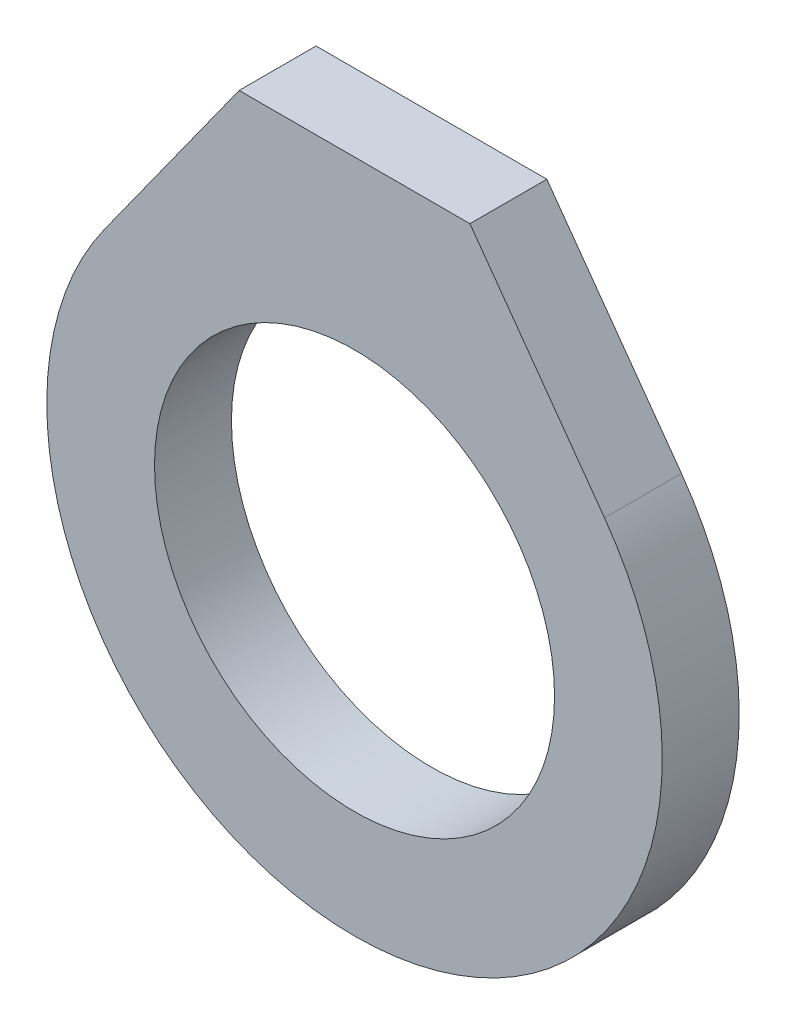
ISO-10303-21;
HEADER;
FILE_DESCRIPTION(('STEP AP214'),'2;1');
FILE_NAME('part.step','',(''),(''),'','','');
FILE_SCHEMA(('AUTOMOTIVE_DESIGN { 1 0 10303 214 1 1 1 1 }'));
ENDSEC;
DATA;
#1=APPLICATION_CONTEXT('core data for automotive mechanical design processes');
#2=APPLICATION_PROTOCOL_DEFINITION('international standard','automotive_design',2000,#1);
#3=PRODUCT_CONTEXT('',#1,'mechanical');
#4=PRODUCT('Part','Part','',(#3));
#5=PRODUCT_RELATED_PRODUCT_CATEGORY('part','',(#4));
#6=PRODUCT_DEFINITION_FORMATION('','',#4);
#7=PRODUCT_DEFINITION_CONTEXT('part definition',#1,'design');
#8=PRODUCT_DEFINITION('design','',#6,#7);
#9=PRODUCT_DEFINITION_SHAPE('','',#8);
#10=(LENGTH_UNIT() NAMED_UNIT(*) SI_UNIT(.MILLI.,.METRE.));
#11=(NAMED_UNIT(*) PLANE_ANGLE_UNIT() SI_UNIT($,.RADIAN.));
#12=(NAMED_UNIT(*) SI_UNIT($,.STERADIAN.) SOLID_ANGLE_UNIT());
#13=UNCERTAINTY_MEASURE_WITH_UNIT(LENGTH_MEASURE(1.E-05),#10,'distance_accuracy_value','');
#14=(GEOMETRIC_REPRESENTATION_CONTEXT(3) GLOBAL_UNCERTAINTY_ASSIGNED_CONTEXT((#13)) GLOBAL_UNIT_ASSIGNED_CONTEXT((#10,
#11,#12)) REPRESENTATION_CONTEXT('',''));
#15=CARTESIAN_POINT('',(0.,0.,0.));
#16=DIRECTION('',(0.,0.,1.));
#17=DIRECTION('',(1.,0.,0.));
#18=AXIS2_PLACEMENT_3D('',#15,#16,#17);
#19=CARTESIAN_POINT('',(0.,0.,5.));
#20=DIRECTION('',(0.,0.,1.));
#21=DIRECTION('',(1.,0.,0.));
#22=AXIS2_PLACEMENT_3D('',#19,#20,#21);
#23=PLANE('',#22);
#24=CARTESIAN_POINT('',(0.,0.,5.));
#25=DIRECTION('',(0.,0.,1.));
#26=DIRECTION('',(1.,0.,0.));
#27=AXIS2_PLACEMENT_3D('',#24,#25,#26);
#28=CIRCLE('',#27,40.);
#29=CARTESIAN_POINT('',(-32.4945408340067,23.3260544453423,5.));
#30=VERTEX_POINT('',#29);
#31=CARTESIAN_POINT('',(32.4945408340067,23.3260544453423,5.));
#32=VERTEX_POINT('',#31);
#33=EDGE_CURVE('E89',#30,#32,#28,.T.);
#34=ORIENTED_EDGE('',*,*,#33,.T.);
#35=DIRECTION('',(-0.583151361133557,0.812363520850167,0.));
#36=VECTOR('',#35,1.);
#37=CARTESIAN_POINT('',(15.,47.6969600708473,5.));
#38=LINE('',#37,#36);
#39=CARTESIAN_POINT('',(15.,47.6969600708473,5.));
#40=VERTEX_POINT('',#39);
#41=EDGE_CURVE('E84',#32,#40,#38,.T.);
#42=ORIENTED_EDGE('',*,*,#41,.T.);
#43=DIRECTION('',(-1.,0.,0.));
#44=VECTOR('',#43,1.);
#45=CARTESIAN_POINT('',(-15.,47.6969600708473,5.));
#46=LINE('',#45,#44);
#47=CARTESIAN_POINT('',(-15.,47.6969600708473,5.));
#48=VERTEX_POINT('',#47);
#49=EDGE_CURVE('E87',#40,#48,#46,.T.);
#50=ORIENTED_EDGE('',*,*,#49,.T.);
#51=DIRECTION('',(-0.583151361133557,-0.812363520850167,0.));
#52=VECTOR('',#51,1.);
#53=CARTESIAN_POINT('',(-32.4945408340067,23.3260544453423,5.));
#54=LINE('',#53,#52);
#55=EDGE_CURVE('E54',#48,#30,#54,.T.);
#56=ORIENTED_EDGE('',*,*,#55,.T.);
#57=EDGE_LOOP('',(#34,#42,#50,#56));
#58=FACE_BOUND('',#57,.T.);
#59=CARTESIAN_POINT('',(0.,0.,5.));
#60=DIRECTION('',(0.,0.,1.));
#61=DIRECTION('',(1.,0.,0.));
#62=AXIS2_PLACEMENT_3D('',#59,#60,#61);
#63=CIRCLE('',#62,26.);
#64=CARTESIAN_POINT('',(26.,0.,5.));
#65=VERTEX_POINT('',#64);
#66=EDGE_CURVE('E104',#65,#65,#63,.T.);
#67=ORIENTED_EDGE('',*,*,#66,.F.);
#68=EDGE_LOOP('',(#67));
#69=FACE_BOUND('',#68,.T.);
#70=ADVANCED_FACE('F37',(#58,#69),#23,.T.);
#71=CARTESIAN_POINT('',(0.,0.,-5.));
#72=DIRECTION('',(0.,0.,1.));
#73=DIRECTION('',(1.,0.,0.));
#74=AXIS2_PLACEMENT_3D('',#71,#72,#73);
#75=PLANE('',#74);
#76=CARTESIAN_POINT('',(0.,0.,-5.));
#77=DIRECTION('',(0.,0.,1.));
#78=DIRECTION('',(1.,0.,0.));
#79=AXIS2_PLACEMENT_3D('',#76,#77,#78);
#80=CIRCLE('',#79,40.);
#81=CARTESIAN_POINT('',(-32.4945408340067,23.3260544453423,-5.));
#82=VERTEX_POINT('',#81);
#83=CARTESIAN_POINT('',(32.4945408340067,23.3260544453423,-5.));
#84=VERTEX_POINT('',#83);
#85=EDGE_CURVE('E101',#82,#84,#80,.T.);
#86=ORIENTED_EDGE('',*,*,#85,.F.);
#87=DIRECTION('',(-0.583151361133557,-0.812363520850167,0.));
#88=VECTOR('',#87,1.);
#89=CARTESIAN_POINT('',(-32.4945408340067,23.3260544453423,-5.));
#90=LINE('',#89,#88);
#91=CARTESIAN_POINT('',(-15.,47.6969600708473,-5.));
#92=VERTEX_POINT('',#91);
#93=EDGE_CURVE('E77',#92,#82,#90,.T.);
#94=ORIENTED_EDGE('',*,*,#93,.F.);
#95=DIRECTION('',(-1.,0.,0.));
#96=VECTOR('',#95,1.);
#97=CARTESIAN_POINT('',(-15.,47.6969600708473,-5.));
#98=LINE('',#97,#96);
#99=CARTESIAN_POINT('',(15.,47.6969600708473,-5.));
#100=VERTEX_POINT('',#99);
#101=EDGE_CURVE('E71',#100,#92,#98,.T.);
#102=ORIENTED_EDGE('',*,*,#101,.F.);
#103=DIRECTION('',(-0.583151361133557,0.812363520850167,0.));
#104=VECTOR('',#103,1.);
#105=CARTESIAN_POINT('',(15.,47.6969600708473,-5.));
#106=LINE('',#105,#104);
#107=EDGE_CURVE('E93',#84,#100,#106,.T.);
#108=ORIENTED_EDGE('',*,*,#107,.F.);
#109=EDGE_LOOP('',(#86,#94,#102,#108));
#110=FACE_BOUND('',#109,.T.);
#111=CARTESIAN_POINT('',(0.,0.,-5.));
#112=DIRECTION('',(0.,0.,1.));
#113=DIRECTION('',(1.,0.,0.));
#114=AXIS2_PLACEMENT_3D('',#111,#112,#113);
#115=CIRCLE('',#114,26.);
#116=CARTESIAN_POINT('',(26.,0.,-5.));
#117=VERTEX_POINT('',#116);
#118=EDGE_CURVE('E116',#117,#117,#115,.T.);
#119=ORIENTED_EDGE('',*,*,#118,.T.);
#120=EDGE_LOOP('',(#119));
#121=FACE_BOUND('',#120,.T.);
#122=ADVANCED_FACE('F112',(#110,#121),#75,.F.);
#123=CARTESIAN_POINT('',(0.,0.,5.));
#124=DIRECTION('',(0.,0.,-1.));
#125=DIRECTION('',(-1.,0.,0.));
#126=AXIS2_PLACEMENT_3D('',#123,#124,#125);
#127=CYLINDRICAL_SURFACE('',#126,40.);
#128=ORIENTED_EDGE('',*,*,#85,.T.);
#129=DIRECTION('',(0.,0.,-1.));
#130=VECTOR('',#129,1.);
#131=CARTESIAN_POINT('',(32.4945408340067,23.3260544453423,5.));
#132=LINE('',#131,#130);
#133=EDGE_CURVE('E11',#32,#84,#132,.T.);
#134=ORIENTED_EDGE('',*,*,#133,.F.);
#135=ORIENTED_EDGE('',*,*,#33,.F.);
#136=DIRECTION('',(0.,0.,-1.));
#137=VECTOR('',#136,1.);
#138=CARTESIAN_POINT('',(-32.4945408340067,23.3260544453423,5.));
#139=LINE('',#138,#137);
#140=EDGE_CURVE('E97',#30,#82,#139,.T.);
#141=ORIENTED_EDGE('',*,*,#140,.T.);
#142=EDGE_LOOP('',(#128,#134,#135,#141));
#143=FACE_BOUND('',#142,.T.);
#144=ADVANCED_FACE('F39',(#143),#127,.T.);
#145=CARTESIAN_POINT('',(15.,47.6969600708473,5.));
#146=DIRECTION('',(-0.812363520850167,-0.583151361133557,0.));
#147=DIRECTION('',(0.583151361133557,-0.812363520850167,0.));
#148=AXIS2_PLACEMENT_3D('',#145,#146,#147);
#149=PLANE('',#148);
#150=ORIENTED_EDGE('',*,*,#107,.T.);
#151=DIRECTION('',(0.,0.,-1.));
#152=VECTOR('',#151,1.);
#153=CARTESIAN_POINT('',(15.,47.6969600708473,5.));
#154=LINE('',#153,#152);
#155=EDGE_CURVE('E46',#40,#100,#154,.T.);
#156=ORIENTED_EDGE('',*,*,#155,.F.);
#157=ORIENTED_EDGE('',*,*,#41,.F.);
#158=ORIENTED_EDGE('',*,*,#133,.T.);
#159=EDGE_LOOP('',(#150,#156,#157,#158));
#160=FACE_BOUND('',#159,.T.);
#161=ADVANCED_FACE('F92',(#160),#149,.F.);
#162=CARTESIAN_POINT('',(-15.,47.6969600708473,5.));
#163=DIRECTION('',(0.,-1.,0.));
#164=DIRECTION('',(0.,0.,-1.));
#165=AXIS2_PLACEMENT_3D('',#162,#163,#164);
#166=PLANE('',#165);
#167=ORIENTED_EDGE('',*,*,#101,.T.);
#168=DIRECTION('',(0.,0.,-1.));
#169=VECTOR('',#168,1.);
#170=CARTESIAN_POINT('',(-15.,47.6969600708473,5.));
#171=LINE('',#170,#169);
#172=EDGE_CURVE('E94',#48,#92,#171,.T.);
#173=ORIENTED_EDGE('',*,*,#172,.F.);
#174=ORIENTED_EDGE('',*,*,#49,.F.);
#175=ORIENTED_EDGE('',*,*,#155,.T.);
#176=EDGE_LOOP('',(#167,#173,#174,#175));
#177=FACE_BOUND('',#176,.T.);
#178=ADVANCED_FACE('F95',(#177),#166,.F.);
#179=CARTESIAN_POINT('',(-32.4945408340067,23.3260544453423,5.));
#180=DIRECTION('',(0.812363520850167,-0.583151361133557,0.));
#181=DIRECTION('',(0.583151361133557,0.812363520850167,0.));
#182=AXIS2_PLACEMENT_3D('',#179,#180,#181);
#183=PLANE('',#182);
#184=ORIENTED_EDGE('',*,*,#93,.T.);
#185=ORIENTED_EDGE('',*,*,#140,.F.);
#186=ORIENTED_EDGE('',*,*,#55,.F.);
#187=ORIENTED_EDGE('',*,*,#172,.T.);
#188=EDGE_LOOP('',(#184,#185,#186,#187));
#189=FACE_BOUND('',#188,.T.);
#190=ADVANCED_FACE('F109',(#189),#183,.F.);
#191=CARTESIAN_POINT('',(0.,0.,5.));
#192=DIRECTION('',(0.,0.,-1.));
#193=DIRECTION('',(-1.,0.,0.));
#194=AXIS2_PLACEMENT_3D('',#191,#192,#193);
#195=CYLINDRICAL_SURFACE('',#194,26.);
#196=ORIENTED_EDGE('',*,*,#66,.T.);
#197=EDGE_LOOP('',(#196));
#198=FACE_BOUND('',#197,.T.);
#199=ORIENTED_EDGE('',*,*,#118,.F.);
#200=EDGE_LOOP('',(#199));
#201=FACE_BOUND('',#200,.T.);
#202=ADVANCED_FACE('F122',(#198,#201),#195,.F.);
#203=CLOSED_SHELL('',(#70,#122,#144,#161,#178,#190,#202));
#204=MANIFOLD_SOLID_BREP('B2',#203);
#205=ADVANCED_BREP_SHAPE_REPRESENTATION('',(#18,#204),#14);
#206=SHAPE_DEFINITION_REPRESENTATION(#9,#205);
ENDSEC;
END-ISO-10303-21;
